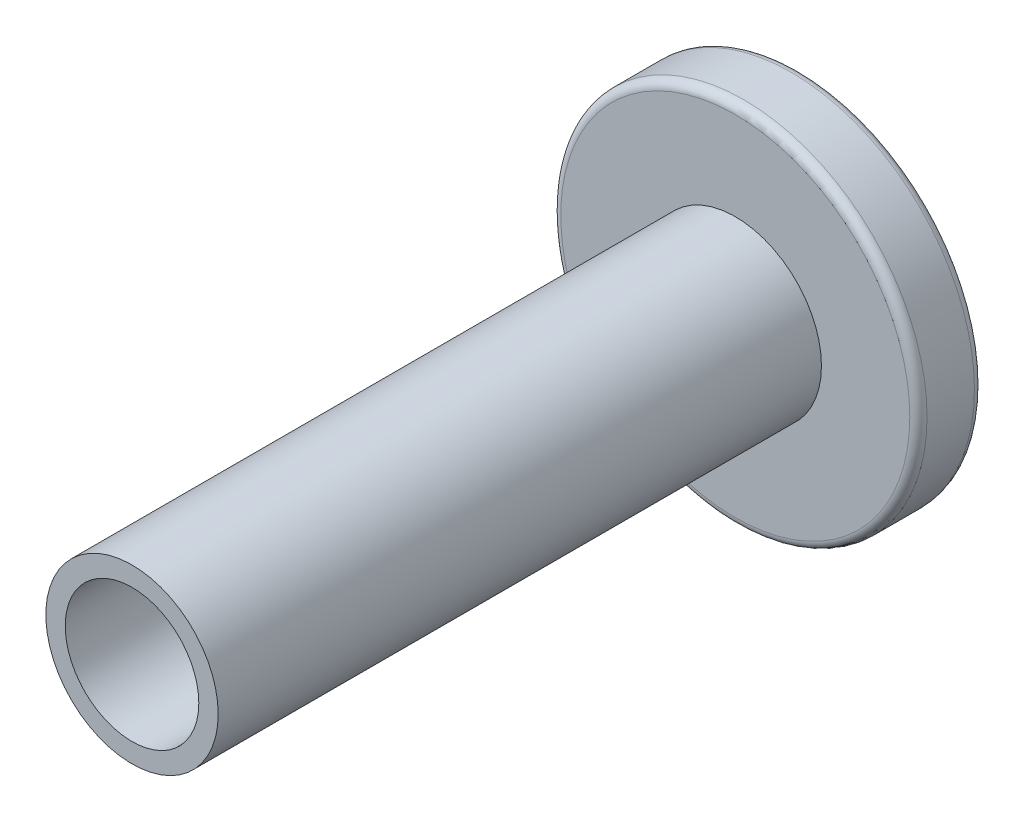
ISO-10303-21;
HEADER;
FILE_DESCRIPTION(('STEP AP214'),'2;1');
FILE_NAME('part.step','',(''),(''),'','','');
FILE_SCHEMA(('AUTOMOTIVE_DESIGN { 1 0 10303 214 1 1 1 1 }'));
ENDSEC;
DATA;
#1=APPLICATION_CONTEXT('core data for automotive mechanical design processes');
#2=APPLICATION_PROTOCOL_DEFINITION('international standard','automotive_design',2000,#1);
#3=PRODUCT_CONTEXT('',#1,'mechanical');
#4=PRODUCT('Part','Part','',(#3));
#5=PRODUCT_RELATED_PRODUCT_CATEGORY('part','',(#4));
#6=PRODUCT_DEFINITION_FORMATION('','',#4);
#7=PRODUCT_DEFINITION_CONTEXT('part definition',#1,'design');
#8=PRODUCT_DEFINITION('design','',#6,#7);
#9=PRODUCT_DEFINITION_SHAPE('','',#8);
#10=(LENGTH_UNIT() NAMED_UNIT(*) SI_UNIT(.MILLI.,.METRE.));
#11=(NAMED_UNIT(*) PLANE_ANGLE_UNIT() SI_UNIT($,.RADIAN.));
#12=(NAMED_UNIT(*) SI_UNIT($,.STERADIAN.) SOLID_ANGLE_UNIT());
#13=UNCERTAINTY_MEASURE_WITH_UNIT(LENGTH_MEASURE(1.E-05),#10,'distance_accuracy_value','');
#14=(GEOMETRIC_REPRESENTATION_CONTEXT(3) GLOBAL_UNCERTAINTY_ASSIGNED_CONTEXT((#13)) GLOBAL_UNIT_ASSIGNED_CONTEXT((#10,
#11,#12)) REPRESENTATION_CONTEXT('',''));
#15=CARTESIAN_POINT('',(0.,0.,0.));
#16=DIRECTION('',(0.,0.,1.));
#17=DIRECTION('',(1.,0.,0.));
#18=AXIS2_PLACEMENT_3D('',#15,#16,#17);
#19=CARTESIAN_POINT('',(0.,0.,1.5));
#20=DIRECTION('',(0.,0.,1.));
#21=DIRECTION('',(1.,0.,0.));
#22=AXIS2_PLACEMENT_3D('',#19,#20,#21);
#23=PLANE('',#22);
#24=CARTESIAN_POINT('',(0.,0.,1.5));
#25=DIRECTION('',(0.,0.,1.));
#26=DIRECTION('',(1.,0.,0.));
#27=AXIS2_PLACEMENT_3D('',#24,#25,#26);
#28=CIRCLE('',#27,1.55);
#29=CARTESIAN_POINT('',(1.55,0.,1.5));
#30=VERTEX_POINT('',#29);
#31=EDGE_CURVE('E152',#30,#30,#28,.F.);
#32=ORIENTED_EDGE('',*,*,#31,.F.);
#33=EDGE_LOOP('',(#32));
#34=FACE_BOUND('',#33,.T.);
#35=DIRECTION('',(-1.,0.,0.));
#36=VECTOR('',#35,1.);
#37=CARTESIAN_POINT('',(0.721687836487032,-1.25,1.5));
#38=LINE('',#37,#36);
#39=CARTESIAN_POINT('',(0.721687836487032,-1.25,1.5));
#40=VERTEX_POINT('',#39);
#41=CARTESIAN_POINT('',(-0.721687836487033,-1.25,1.5));
#42=VERTEX_POINT('',#41);
#43=EDGE_CURVE('E103',#40,#42,#38,.T.);
#44=ORIENTED_EDGE('',*,*,#43,.T.);
#45=DIRECTION('',(-0.5,0.866025403784438,0.));
#46=VECTOR('',#45,1.);
#47=CARTESIAN_POINT('',(-0.721687836487033,-1.25,1.5));
#48=LINE('',#47,#46);
#49=CARTESIAN_POINT('',(-1.44337567297407,0.,1.5));
#50=VERTEX_POINT('',#49);
#51=EDGE_CURVE('E97',#42,#50,#48,.T.);
#52=ORIENTED_EDGE('',*,*,#51,.T.);
#53=DIRECTION('',(0.5,0.866025403784438,0.));
#54=VECTOR('',#53,1.);
#55=CARTESIAN_POINT('',(-1.44337567297407,0.,1.5));
#56=LINE('',#55,#54);
#57=CARTESIAN_POINT('',(-0.721687836487032,1.25,1.5));
#58=VERTEX_POINT('',#57);
#59=EDGE_CURVE('E106',#50,#58,#56,.T.);
#60=ORIENTED_EDGE('',*,*,#59,.T.);
#61=DIRECTION('',(1.,0.,0.));
#62=VECTOR('',#61,1.);
#63=CARTESIAN_POINT('',(-0.721687836487032,1.25,1.5));
#64=LINE('',#63,#62);
#65=CARTESIAN_POINT('',(0.721687836487032,1.25,1.5));
#66=VERTEX_POINT('',#65);
#67=EDGE_CURVE('E57',#58,#66,#64,.T.);
#68=ORIENTED_EDGE('',*,*,#67,.T.);
#69=DIRECTION('',(0.5,-0.866025403784438,0.));
#70=VECTOR('',#69,1.);
#71=CARTESIAN_POINT('',(0.721687836487032,1.25,1.5));
#72=LINE('',#71,#70);
#73=CARTESIAN_POINT('',(1.44337567297406,0.,1.5));
#74=VERTEX_POINT('',#73);
#75=EDGE_CURVE('E119',#66,#74,#72,.T.);
#76=ORIENTED_EDGE('',*,*,#75,.T.);
#77=DIRECTION('',(-0.5,-0.866025403784438,0.));
#78=VECTOR('',#77,1.);
#79=CARTESIAN_POINT('',(1.44337567297406,0.,1.5));
#80=LINE('',#79,#78);
#81=EDGE_CURVE('E122',#74,#40,#80,.T.);
#82=ORIENTED_EDGE('',*,*,#81,.T.);
#83=EDGE_LOOP('',(#44,#52,#60,#68,#76,#82));
#84=FACE_BOUND('',#83,.T.);
#85=ADVANCED_FACE('F42',(#34,#84),#23,.T.);
#86=CARTESIAN_POINT('',(0.,0.,1.5));
#87=DIRECTION('',(0.,0.,-1.));
#88=DIRECTION('',(-1.,0.,0.));
#89=AXIS2_PLACEMENT_3D('',#86,#87,#88);
#90=CYLINDRICAL_SURFACE('',#89,4.25);
#91=CARTESIAN_POINT('',(0.,0.,0.2));
#92=DIRECTION('',(0.,0.,1.));
#93=DIRECTION('',(1.,0.,0.));
#94=AXIS2_PLACEMENT_3D('',#91,#92,#93);
#95=CIRCLE('',#94,4.25);
#96=CARTESIAN_POINT('',(4.25,0.,0.2));
#97=VERTEX_POINT('',#96);
#98=EDGE_CURVE('E160',#97,#97,#95,.T.);
#99=ORIENTED_EDGE('',*,*,#98,.T.);
#100=EDGE_LOOP('',(#99));
#101=FACE_BOUND('',#100,.T.);
#102=CARTESIAN_POINT('',(0.,0.,1.3));
#103=DIRECTION('',(0.,0.,1.));
#104=DIRECTION('',(1.,0.,0.));
#105=AXIS2_PLACEMENT_3D('',#102,#103,#104);
#106=CIRCLE('',#105,4.25);
#107=CARTESIAN_POINT('',(4.25,0.,1.3));
#108=VERTEX_POINT('',#107);
#109=EDGE_CURVE('E157',#108,#108,#106,.F.);
#110=ORIENTED_EDGE('',*,*,#109,.T.);
#111=EDGE_LOOP('',(#110));
#112=FACE_BOUND('',#111,.T.);
#113=ADVANCED_FACE('F173',(#101,#112),#90,.T.);
#114=CARTESIAN_POINT('',(0.,0.,1.5));
#115=DIRECTION('',(0.,0.,1.));
#116=DIRECTION('',(1.,0.,0.));
#117=AXIS2_PLACEMENT_3D('',#114,#115,#116);
#118=CIRCLE('',#117,4.05);
#119=CARTESIAN_POINT('',(4.05,0.,1.5));
#120=VERTEX_POINT('',#119);
#121=EDGE_CURVE('E11',#120,#120,#118,.T.);
#122=ORIENTED_EDGE('',*,*,#121,.T.);
#123=EDGE_LOOP('',(#122));
#124=FACE_BOUND('',#123,.T.);
#125=CARTESIAN_POINT('',(0.,0.,1.5));
#126=DIRECTION('',(0.,0.,1.));
#127=DIRECTION('',(1.,0.,0.));
#128=AXIS2_PLACEMENT_3D('',#125,#126,#127);
#129=CIRCLE('',#128,2.);
#130=CARTESIAN_POINT('',(2.,0.,1.5));
#131=VERTEX_POINT('',#130);
#132=EDGE_CURVE('E148',#131,#131,#129,.T.);
#133=ORIENTED_EDGE('',*,*,#132,.F.);
#134=EDGE_LOOP('',(#133));
#135=FACE_BOUND('',#134,.T.);
#136=ADVANCED_FACE('F176',(#124,#135),#23,.T.);
#137=CARTESIAN_POINT('',(0.,0.,0.));
#138=DIRECTION('',(0.,0.,1.));
#139=DIRECTION('',(1.,0.,0.));
#140=AXIS2_PLACEMENT_3D('',#137,#138,#139);
#141=PLANE('',#140);
#142=DIRECTION('',(0.5,0.866025403784438,0.));
#143=VECTOR('',#142,1.);
#144=CARTESIAN_POINT('',(-1.44337567297407,0.,0.));
#145=LINE('',#144,#143);
#146=CARTESIAN_POINT('',(-1.44337567297407,0.,0.));
#147=VERTEX_POINT('',#146);
#148=CARTESIAN_POINT('',(-0.721687836487032,1.25,0.));
#149=VERTEX_POINT('',#148);
#150=EDGE_CURVE('E126',#147,#149,#145,.T.);
#151=ORIENTED_EDGE('',*,*,#150,.F.);
#152=DIRECTION('',(-0.5,0.866025403784438,0.));
#153=VECTOR('',#152,1.);
#154=CARTESIAN_POINT('',(-0.721687836487033,-1.25,0.));
#155=LINE('',#154,#153);
#156=CARTESIAN_POINT('',(-0.721687836487033,-1.25,0.));
#157=VERTEX_POINT('',#156);
#158=EDGE_CURVE('E65',#157,#147,#155,.T.);
#159=ORIENTED_EDGE('',*,*,#158,.F.);
#160=DIRECTION('',(-1.,0.,0.));
#161=VECTOR('',#160,1.);
#162=CARTESIAN_POINT('',(0.721687836487032,-1.25,0.));
#163=LINE('',#162,#161);
#164=CARTESIAN_POINT('',(0.721687836487032,-1.25,0.));
#165=VERTEX_POINT('',#164);
#166=EDGE_CURVE('E112',#165,#157,#163,.T.);
#167=ORIENTED_EDGE('',*,*,#166,.F.);
#168=DIRECTION('',(-0.5,-0.866025403784438,0.));
#169=VECTOR('',#168,1.);
#170=CARTESIAN_POINT('',(1.44337567297406,0.,0.));
#171=LINE('',#170,#169);
#172=CARTESIAN_POINT('',(1.44337567297406,0.,0.));
#173=VERTEX_POINT('',#172);
#174=EDGE_CURVE('E115',#173,#165,#171,.T.);
#175=ORIENTED_EDGE('',*,*,#174,.F.);
#176=DIRECTION('',(0.5,-0.866025403784438,0.));
#177=VECTOR('',#176,1.);
#178=CARTESIAN_POINT('',(0.721687836487032,1.25,0.));
#179=LINE('',#178,#177);
#180=CARTESIAN_POINT('',(0.721687836487032,1.25,0.));
#181=VERTEX_POINT('',#180);
#182=EDGE_CURVE('E131',#181,#173,#179,.T.);
#183=ORIENTED_EDGE('',*,*,#182,.F.);
#184=DIRECTION('',(1.,0.,0.));
#185=VECTOR('',#184,1.);
#186=CARTESIAN_POINT('',(-0.721687836487032,1.25,0.));
#187=LINE('',#186,#185);
#188=EDGE_CURVE('E128',#149,#181,#187,.T.);
#189=ORIENTED_EDGE('',*,*,#188,.F.);
#190=EDGE_LOOP('',(#151,#159,#167,#175,#183,#189));
#191=FACE_BOUND('',#190,.T.);
#192=CARTESIAN_POINT('',(0.,0.,0.));
#193=DIRECTION('',(0.,0.,1.));
#194=DIRECTION('',(1.,0.,0.));
#195=AXIS2_PLACEMENT_3D('',#192,#193,#194);
#196=CIRCLE('',#195,4.05);
#197=CARTESIAN_POINT('',(4.05,0.,0.));
#198=VERTEX_POINT('',#197);
#199=EDGE_CURVE('E50',#198,#198,#196,.F.);
#200=ORIENTED_EDGE('',*,*,#199,.T.);
#201=EDGE_LOOP('',(#200));
#202=FACE_BOUND('',#201,.T.);
#203=ADVANCED_FACE('F165',(#191,#202),#141,.F.);
#204=CARTESIAN_POINT('',(0.,0.,15.5));
#205=DIRECTION('',(0.,0.,1.));
#206=DIRECTION('',(1.,0.,0.));
#207=AXIS2_PLACEMENT_3D('',#204,#205,#206);
#208=PLANE('',#207);
#209=CARTESIAN_POINT('',(0.,0.,15.5));
#210=DIRECTION('',(0.,0.,1.));
#211=DIRECTION('',(1.,0.,0.));
#212=AXIS2_PLACEMENT_3D('',#209,#210,#211);
#213=CIRCLE('',#212,2.);
#214=CARTESIAN_POINT('',(2.,0.,15.5));
#215=VERTEX_POINT('',#214);
#216=EDGE_CURVE('E149',#215,#215,#213,.T.);
#217=ORIENTED_EDGE('',*,*,#216,.T.);
#218=EDGE_LOOP('',(#217));
#219=FACE_BOUND('',#218,.T.);
#220=CARTESIAN_POINT('',(0.,0.,15.5));
#221=DIRECTION('',(0.,0.,1.));
#222=DIRECTION('',(1.,0.,0.));
#223=AXIS2_PLACEMENT_3D('',#220,#221,#222);
#224=CIRCLE('',#223,1.55);
#225=CARTESIAN_POINT('',(1.55,0.,15.5));
#226=VERTEX_POINT('',#225);
#227=EDGE_CURVE('E138',#226,#226,#224,.T.);
#228=ORIENTED_EDGE('',*,*,#227,.F.);
#229=EDGE_LOOP('',(#228));
#230=FACE_BOUND('',#229,.T.);
#231=ADVANCED_FACE('F191',(#219,#230),#208,.T.);
#232=CARTESIAN_POINT('',(0.,0.,15.5));
#233=DIRECTION('',(0.,0.,-1.));
#234=DIRECTION('',(-1.,0.,0.));
#235=AXIS2_PLACEMENT_3D('',#232,#233,#234);
#236=CYLINDRICAL_SURFACE('',#235,2.);
#237=ORIENTED_EDGE('',*,*,#216,.F.);
#238=EDGE_LOOP('',(#237));
#239=FACE_BOUND('',#238,.T.);
#240=ORIENTED_EDGE('',*,*,#132,.T.);
#241=EDGE_LOOP('',(#240));
#242=FACE_BOUND('',#241,.T.);
#243=ADVANCED_FACE('F189',(#239,#242),#236,.T.);
#244=CARTESIAN_POINT('',(0.,0.,15.5));
#245=DIRECTION('',(0.,0.,-1.));
#246=DIRECTION('',(-1.,0.,0.));
#247=AXIS2_PLACEMENT_3D('',#244,#245,#246);
#248=CYLINDRICAL_SURFACE('',#247,1.55);
#249=ORIENTED_EDGE('',*,*,#227,.T.);
#250=EDGE_LOOP('',(#249));
#251=FACE_BOUND('',#250,.T.);
#252=ORIENTED_EDGE('',*,*,#31,.T.);
#253=EDGE_LOOP('',(#252));
#254=FACE_BOUND('',#253,.T.);
#255=ADVANCED_FACE('F170',(#251,#254),#248,.F.);
#256=CARTESIAN_POINT('',(0.,0.,0.2));
#257=DIRECTION('',(0.,0.,1.));
#258=DIRECTION('',(1.,0.,0.));
#259=AXIS2_PLACEMENT_3D('',#256,#257,#258);
#260=TOROIDAL_SURFACE('',#259,4.05,0.2);
#261=ORIENTED_EDGE('',*,*,#199,.F.);
#262=EDGE_LOOP('',(#261));
#263=FACE_BOUND('',#262,.T.);
#264=ORIENTED_EDGE('',*,*,#98,.F.);
#265=EDGE_LOOP('',(#264));
#266=FACE_BOUND('',#265,.T.);
#267=ADVANCED_FACE('F167',(#263,#266),#260,.T.);
#268=CARTESIAN_POINT('',(0.,0.,1.3));
#269=DIRECTION('',(0.,0.,1.));
#270=DIRECTION('',(1.,0.,0.));
#271=AXIS2_PLACEMENT_3D('',#268,#269,#270);
#272=TOROIDAL_SURFACE('',#271,4.05,0.2);
#273=ORIENTED_EDGE('',*,*,#109,.F.);
#274=EDGE_LOOP('',(#273));
#275=FACE_BOUND('',#274,.T.);
#276=ORIENTED_EDGE('',*,*,#121,.F.);
#277=EDGE_LOOP('',(#276));
#278=FACE_BOUND('',#277,.T.);
#279=ADVANCED_FACE('F44',(#275,#278),#272,.T.);
#280=CARTESIAN_POINT('',(-0.721687836487033,-1.25,1.5));
#281=DIRECTION('',(-0.866025403784439,-0.5,0.));
#282=DIRECTION('',(0.5,-0.866025403784439,0.));
#283=AXIS2_PLACEMENT_3D('',#280,#281,#282);
#284=PLANE('',#283);
#285=ORIENTED_EDGE('',*,*,#158,.T.);
#286=DIRECTION('',(0.,0.,-1.));
#287=VECTOR('',#286,1.);
#288=CARTESIAN_POINT('',(-1.44337567297407,0.,1.5));
#289=LINE('',#288,#287);
#290=EDGE_CURVE('E93',#50,#147,#289,.T.);
#291=ORIENTED_EDGE('',*,*,#290,.F.);
#292=ORIENTED_EDGE('',*,*,#51,.F.);
#293=DIRECTION('',(0.,0.,-1.));
#294=VECTOR('',#293,1.);
#295=CARTESIAN_POINT('',(-0.721687836487033,-1.25,1.5));
#296=LINE('',#295,#294);
#297=EDGE_CURVE('E136',#42,#157,#296,.T.);
#298=ORIENTED_EDGE('',*,*,#297,.T.);
#299=EDGE_LOOP('',(#285,#291,#292,#298));
#300=FACE_BOUND('',#299,.T.);
#301=ADVANCED_FACE('F95',(#300),#284,.F.);
#302=CARTESIAN_POINT('',(0.721687836487032,-1.25,1.5));
#303=DIRECTION('',(0.,-1.,0.));
#304=DIRECTION('',(1.,0.,0.));
#305=AXIS2_PLACEMENT_3D('',#302,#303,#304);
#306=PLANE('',#305);
#307=ORIENTED_EDGE('',*,*,#166,.T.);
#308=ORIENTED_EDGE('',*,*,#297,.F.);
#309=ORIENTED_EDGE('',*,*,#43,.F.);
#310=DIRECTION('',(0.,0.,-1.));
#311=VECTOR('',#310,1.);
#312=CARTESIAN_POINT('',(0.721687836487032,-1.25,1.5));
#313=LINE('',#312,#311);
#314=EDGE_CURVE('E139',#40,#165,#313,.T.);
#315=ORIENTED_EDGE('',*,*,#314,.T.);
#316=EDGE_LOOP('',(#307,#308,#309,#315));
#317=FACE_BOUND('',#316,.T.);
#318=ADVANCED_FACE('F225',(#317),#306,.F.);
#319=CARTESIAN_POINT('',(1.44337567297406,0.,1.5));
#320=DIRECTION('',(0.866025403784439,-0.5,0.));
#321=DIRECTION('',(0.5,0.866025403784439,0.));
#322=AXIS2_PLACEMENT_3D('',#319,#320,#321);
#323=PLANE('',#322);
#324=ORIENTED_EDGE('',*,*,#174,.T.);
#325=ORIENTED_EDGE('',*,*,#314,.F.);
#326=ORIENTED_EDGE('',*,*,#81,.F.);
#327=DIRECTION('',(0.,0.,-1.));
#328=VECTOR('',#327,1.);
#329=CARTESIAN_POINT('',(1.44337567297406,0.,1.5));
#330=LINE('',#329,#328);
#331=EDGE_CURVE('E141',#74,#173,#330,.T.);
#332=ORIENTED_EDGE('',*,*,#331,.T.);
#333=EDGE_LOOP('',(#324,#325,#326,#332));
#334=FACE_BOUND('',#333,.T.);
#335=ADVANCED_FACE('F223',(#334),#323,.F.);
#336=CARTESIAN_POINT('',(0.721687836487032,1.25,1.5));
#337=DIRECTION('',(0.866025403784439,0.5,0.));
#338=DIRECTION('',(-0.5,0.866025403784439,0.));
#339=AXIS2_PLACEMENT_3D('',#336,#337,#338);
#340=PLANE('',#339);
#341=ORIENTED_EDGE('',*,*,#182,.T.);
#342=ORIENTED_EDGE('',*,*,#331,.F.);
#343=ORIENTED_EDGE('',*,*,#75,.F.);
#344=DIRECTION('',(0.,0.,-1.));
#345=VECTOR('',#344,1.);
#346=CARTESIAN_POINT('',(0.721687836487032,1.25,1.5));
#347=LINE('',#346,#345);
#348=EDGE_CURVE('E143',#66,#181,#347,.T.);
#349=ORIENTED_EDGE('',*,*,#348,.T.);
#350=EDGE_LOOP('',(#341,#342,#343,#349));
#351=FACE_BOUND('',#350,.T.);
#352=ADVANCED_FACE('F220',(#351),#340,.F.);
#353=CARTESIAN_POINT('',(-0.721687836487032,1.25,1.5));
#354=DIRECTION('',(0.,1.,0.));
#355=DIRECTION('',(0.,0.,1.));
#356=AXIS2_PLACEMENT_3D('',#353,#354,#355);
#357=PLANE('',#356);
#358=ORIENTED_EDGE('',*,*,#188,.T.);
#359=ORIENTED_EDGE('',*,*,#348,.F.);
#360=ORIENTED_EDGE('',*,*,#67,.F.);
#361=DIRECTION('',(0.,0.,-1.));
#362=VECTOR('',#361,1.);
#363=CARTESIAN_POINT('',(-0.721687836487032,1.25,1.5));
#364=LINE('',#363,#362);
#365=EDGE_CURVE('E102',#58,#149,#364,.T.);
#366=ORIENTED_EDGE('',*,*,#365,.T.);
#367=EDGE_LOOP('',(#358,#359,#360,#366));
#368=FACE_BOUND('',#367,.T.);
#369=ADVANCED_FACE('F217',(#368),#357,.F.);
#370=CARTESIAN_POINT('',(-1.44337567297407,0.,1.5));
#371=DIRECTION('',(-0.866025403784438,0.5,0.));
#372=DIRECTION('',(-0.5,-0.866025403784438,0.));
#373=AXIS2_PLACEMENT_3D('',#370,#371,#372);
#374=PLANE('',#373);
#375=ORIENTED_EDGE('',*,*,#150,.T.);
#376=ORIENTED_EDGE('',*,*,#365,.F.);
#377=ORIENTED_EDGE('',*,*,#59,.F.);
#378=ORIENTED_EDGE('',*,*,#290,.T.);
#379=EDGE_LOOP('',(#375,#376,#377,#378));
#380=FACE_BOUND('',#379,.T.);
#381=ADVANCED_FACE('F107',(#380),#374,.F.);
#382=CLOSED_SHELL('',(#85,#113,#136,#203,#231,#243,#255,#267,#279,#301,#318,#335,#352,#369,#381));
#383=MANIFOLD_SOLID_BREP('B2',#382);
#384=ADVANCED_BREP_SHAPE_REPRESENTATION('',(#18,#383),#14);
#385=SHAPE_DEFINITION_REPRESENTATION(#9,#384);
ENDSEC;
END-ISO-10303-21;
